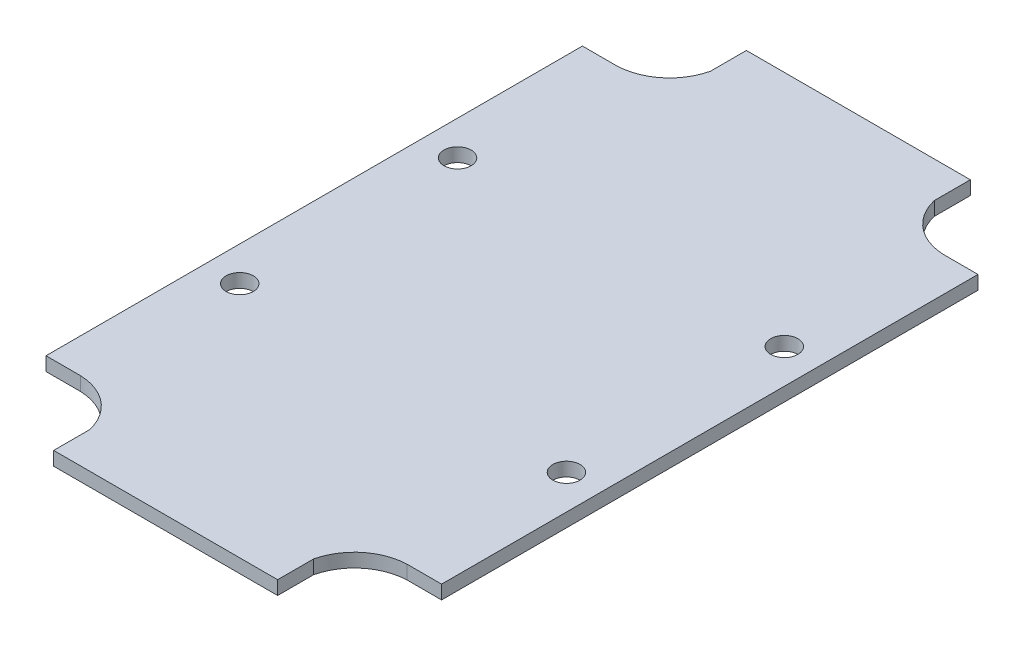
ISO-10303-21;
HEADER;
FILE_DESCRIPTION(('STEP AP214'),'2;1');
FILE_NAME('part.step','',(''),(''),'','','');
FILE_SCHEMA(('AUTOMOTIVE_DESIGN { 1 0 10303 214 1 1 1 1 }'));
ENDSEC;
DATA;
#1=APPLICATION_CONTEXT('core data for automotive mechanical design processes');
#2=APPLICATION_PROTOCOL_DEFINITION('international standard','automotive_design',2000,#1);
#3=PRODUCT_CONTEXT('',#1,'mechanical');
#4=PRODUCT('Part','Part','',(#3));
#5=PRODUCT_RELATED_PRODUCT_CATEGORY('part','',(#4));
#6=PRODUCT_DEFINITION_FORMATION('','',#4);
#7=PRODUCT_DEFINITION_CONTEXT('part definition',#1,'design');
#8=PRODUCT_DEFINITION('design','',#6,#7);
#9=PRODUCT_DEFINITION_SHAPE('','',#8);
#10=(LENGTH_UNIT() NAMED_UNIT(*) SI_UNIT(.MILLI.,.METRE.));
#11=(NAMED_UNIT(*) PLANE_ANGLE_UNIT() SI_UNIT($,.RADIAN.));
#12=(NAMED_UNIT(*) SI_UNIT($,.STERADIAN.) SOLID_ANGLE_UNIT());
#13=UNCERTAINTY_MEASURE_WITH_UNIT(LENGTH_MEASURE(1.E-05),#10,'distance_accuracy_value','');
#14=(GEOMETRIC_REPRESENTATION_CONTEXT(3) GLOBAL_UNCERTAINTY_ASSIGNED_CONTEXT((#13)) GLOBAL_UNIT_ASSIGNED_CONTEXT((#10,
#11,#12)) REPRESENTATION_CONTEXT('',''));
#15=CARTESIAN_POINT('',(0.,0.,0.));
#16=DIRECTION('',(0.,0.,1.));
#17=DIRECTION('',(1.,0.,0.));
#18=AXIS2_PLACEMENT_3D('',#15,#16,#17);
#19=CARTESIAN_POINT('',(-19.2435334272155,1.6,-37.621000833476));
#20=DIRECTION('',(0.,-1.,0.));
#21=DIRECTION('',(0.,0.,-1.));
#22=AXIS2_PLACEMENT_3D('',#19,#20,#21);
#23=CYLINDRICAL_SURFACE('',#22,6.35);
#24=CARTESIAN_POINT('',(-19.2435334272155,0.,-37.621000833476));
#25=DIRECTION('',(0.,-1.,0.));
#26=DIRECTION('',(0.,0.,-1.));
#27=AXIS2_PLACEMENT_3D('',#24,#25,#26);
#28=CIRCLE('',#27,6.35);
#29=CARTESIAN_POINT('',(-13.0557210817313,0.,-36.195));
#30=VERTEX_POINT('',#29);
#31=CARTESIAN_POINT('',(-19.05,0.,-31.2739507460298));
#32=VERTEX_POINT('',#31);
#33=EDGE_CURVE('E187',#30,#32,#28,.T.);
#34=ORIENTED_EDGE('',*,*,#33,.T.);
#35=DIRECTION('',(0.,-1.,0.));
#36=VECTOR('',#35,1.);
#37=CARTESIAN_POINT('',(-19.05,1.6,-31.2739507460298));
#38=LINE('',#37,#36);
#39=CARTESIAN_POINT('',(-19.05,1.6,-31.2739507460298));
#40=VERTEX_POINT('',#39);
#41=EDGE_CURVE('E11',#40,#32,#38,.T.);
#42=ORIENTED_EDGE('',*,*,#41,.F.);
#43=CARTESIAN_POINT('',(-19.2435334272155,1.6,-37.621000833476));
#44=DIRECTION('',(0.,-1.,0.));
#45=DIRECTION('',(0.,0.,-1.));
#46=AXIS2_PLACEMENT_3D('',#43,#44,#45);
#47=CIRCLE('',#46,6.35);
#48=CARTESIAN_POINT('',(-13.0557210817313,1.6,-36.195));
#49=VERTEX_POINT('',#48);
#50=EDGE_CURVE('E235',#49,#40,#47,.T.);
#51=ORIENTED_EDGE('',*,*,#50,.F.);
#52=DIRECTION('',(0.,-1.,0.));
#53=VECTOR('',#52,1.);
#54=CARTESIAN_POINT('',(-13.0557210817313,1.6,-36.195));
#55=LINE('',#54,#53);
#56=EDGE_CURVE('E183',#49,#30,#55,.T.);
#57=ORIENTED_EDGE('',*,*,#56,.T.);
#58=EDGE_LOOP('',(#34,#42,#51,#57));
#59=FACE_BOUND('',#58,.T.);
#60=ADVANCED_FACE('F38',(#59),#23,.F.);
#61=CARTESIAN_POINT('',(-23.0632,1.6,-31.2739507460298));
#62=DIRECTION('',(0.,0.,1.));
#63=DIRECTION('',(1.,0.,0.));
#64=AXIS2_PLACEMENT_3D('',#61,#62,#63);
#65=PLANE('',#64);
#66=DIRECTION('',(-1.,0.,0.));
#67=VECTOR('',#66,1.);
#68=CARTESIAN_POINT('',(-23.0632,0.,-31.2739507460298));
#69=LINE('',#68,#67);
#70=CARTESIAN_POINT('',(-23.0632,0.,-31.2739507460298));
#71=VERTEX_POINT('',#70);
#72=EDGE_CURVE('E191',#32,#71,#69,.T.);
#73=ORIENTED_EDGE('',*,*,#72,.T.);
#74=DIRECTION('',(0.,-1.,0.));
#75=VECTOR('',#74,1.);
#76=CARTESIAN_POINT('',(-23.0632,1.6,-31.2739507460298));
#77=LINE('',#76,#75);
#78=CARTESIAN_POINT('',(-23.0632,1.6,-31.2739507460298));
#79=VERTEX_POINT('',#78);
#80=EDGE_CURVE('E47',#79,#71,#77,.T.);
#81=ORIENTED_EDGE('',*,*,#80,.F.);
#82=DIRECTION('',(-1.,0.,0.));
#83=VECTOR('',#82,1.);
#84=CARTESIAN_POINT('',(-23.0632,1.6,-31.2739507460298));
#85=LINE('',#84,#83);
#86=EDGE_CURVE('E122',#40,#79,#85,.T.);
#87=ORIENTED_EDGE('',*,*,#86,.F.);
#88=ORIENTED_EDGE('',*,*,#41,.T.);
#89=EDGE_LOOP('',(#73,#81,#87,#88));
#90=FACE_BOUND('',#89,.T.);
#91=ADVANCED_FACE('F288',(#90),#65,.F.);
#92=CARTESIAN_POINT('',(-23.0632,1.6,31.2739507460298));
#93=DIRECTION('',(1.,0.,0.));
#94=DIRECTION('',(0.,0.,-1.));
#95=AXIS2_PLACEMENT_3D('',#92,#93,#94);
#96=PLANE('',#95);
#97=DIRECTION('',(0.,0.,1.));
#98=VECTOR('',#97,1.);
#99=CARTESIAN_POINT('',(-23.0632,0.,31.2739507460298));
#100=LINE('',#99,#98);
#101=CARTESIAN_POINT('',(-23.0632,0.,31.2739507460298));
#102=VERTEX_POINT('',#101);
#103=EDGE_CURVE('E196',#71,#102,#100,.T.);
#104=ORIENTED_EDGE('',*,*,#103,.T.);
#105=DIRECTION('',(0.,-1.,0.));
#106=VECTOR('',#105,1.);
#107=CARTESIAN_POINT('',(-23.0632,1.6,31.2739507460298));
#108=LINE('',#107,#106);
#109=CARTESIAN_POINT('',(-23.0632,1.6,31.2739507460298));
#110=VERTEX_POINT('',#109);
#111=EDGE_CURVE('E278',#110,#102,#108,.T.);
#112=ORIENTED_EDGE('',*,*,#111,.F.);
#113=DIRECTION('',(0.,0.,1.));
#114=VECTOR('',#113,1.);
#115=CARTESIAN_POINT('',(-23.0632,1.6,0.));
#116=LINE('',#115,#114);
#117=EDGE_CURVE('E287',#79,#110,#116,.T.);
#118=ORIENTED_EDGE('',*,*,#117,.F.);
#119=ORIENTED_EDGE('',*,*,#80,.T.);
#120=EDGE_LOOP('',(#104,#112,#118,#119));
#121=FACE_BOUND('',#120,.T.);
#122=ADVANCED_FACE('F285',(#121),#96,.F.);
#123=CARTESIAN_POINT('',(-23.0632,1.6,31.2739507460298));
#124=DIRECTION('',(0.,0.,-1.));
#125=DIRECTION('',(-1.,0.,0.));
#126=AXIS2_PLACEMENT_3D('',#123,#124,#125);
#127=PLANE('',#126);
#128=DIRECTION('',(1.,0.,0.));
#129=VECTOR('',#128,1.);
#130=CARTESIAN_POINT('',(-23.0632,0.,31.2739507460298));
#131=LINE('',#130,#129);
#132=CARTESIAN_POINT('',(-19.05,0.,31.2739507460298));
#133=VERTEX_POINT('',#132);
#134=EDGE_CURVE('E199',#102,#133,#131,.T.);
#135=ORIENTED_EDGE('',*,*,#134,.T.);
#136=DIRECTION('',(0.,-1.,0.));
#137=VECTOR('',#136,1.);
#138=CARTESIAN_POINT('',(-19.05,1.6,31.2739507460298));
#139=LINE('',#138,#137);
#140=CARTESIAN_POINT('',(-19.05,1.6,31.2739507460298));
#141=VERTEX_POINT('',#140);
#142=EDGE_CURVE('E274',#141,#133,#139,.T.);
#143=ORIENTED_EDGE('',*,*,#142,.F.);
#144=DIRECTION('',(1.,0.,0.));
#145=VECTOR('',#144,1.);
#146=CARTESIAN_POINT('',(-23.0632,1.6,31.2739507460298));
#147=LINE('',#146,#145);
#148=EDGE_CURVE('E308',#110,#141,#147,.T.);
#149=ORIENTED_EDGE('',*,*,#148,.F.);
#150=ORIENTED_EDGE('',*,*,#111,.T.);
#151=EDGE_LOOP('',(#135,#143,#149,#150));
#152=FACE_BOUND('',#151,.T.);
#153=ADVANCED_FACE('F298',(#152),#127,.F.);
#154=CARTESIAN_POINT('',(-19.2435334272155,1.6,37.621000833476));
#155=DIRECTION('',(0.,-1.,0.));
#156=DIRECTION('',(0.,0.,-1.));
#157=AXIS2_PLACEMENT_3D('',#154,#155,#156);
#158=CYLINDRICAL_SURFACE('',#157,6.35);
#159=CARTESIAN_POINT('',(-19.2435334272155,0.,37.621000833476));
#160=DIRECTION('',(0.,-1.,0.));
#161=DIRECTION('',(0.,0.,1.));
#162=AXIS2_PLACEMENT_3D('',#159,#160,#161);
#163=CIRCLE('',#162,6.35);
#164=CARTESIAN_POINT('',(-13.0557210817314,0.,36.195));
#165=VERTEX_POINT('',#164);
#166=EDGE_CURVE('E202',#133,#165,#163,.T.);
#167=ORIENTED_EDGE('',*,*,#166,.T.);
#168=DIRECTION('',(0.,-1.,0.));
#169=VECTOR('',#168,1.);
#170=CARTESIAN_POINT('',(-13.0557210817314,1.6,36.195));
#171=LINE('',#170,#169);
#172=CARTESIAN_POINT('',(-13.0557210817314,1.6,36.195));
#173=VERTEX_POINT('',#172);
#174=EDGE_CURVE('E270',#173,#165,#171,.T.);
#175=ORIENTED_EDGE('',*,*,#174,.F.);
#176=CARTESIAN_POINT('',(-19.2435334272155,1.6,37.621000833476));
#177=DIRECTION('',(0.,-1.,0.));
#178=DIRECTION('',(0.,0.,1.));
#179=AXIS2_PLACEMENT_3D('',#176,#177,#178);
#180=CIRCLE('',#179,6.35);
#181=EDGE_CURVE('E304',#141,#173,#180,.T.);
#182=ORIENTED_EDGE('',*,*,#181,.F.);
#183=ORIENTED_EDGE('',*,*,#142,.T.);
#184=EDGE_LOOP('',(#167,#175,#182,#183));
#185=FACE_BOUND('',#184,.T.);
#186=ADVANCED_FACE('F302',(#185),#158,.F.);
#187=CARTESIAN_POINT('',(-13.0557210817314,1.6,36.195));
#188=DIRECTION('',(1.,0.,0.));
#189=DIRECTION('',(0.,0.,-1.));
#190=AXIS2_PLACEMENT_3D('',#187,#188,#189);
#191=PLANE('',#190);
#192=DIRECTION('',(0.,0.,1.));
#193=VECTOR('',#192,1.);
#194=CARTESIAN_POINT('',(-13.0557210817314,0.,36.195));
#195=LINE('',#194,#193);
#196=CARTESIAN_POINT('',(-13.0557210817314,0.,40.386));
#197=VERTEX_POINT('',#196);
#198=EDGE_CURVE('E205',#165,#197,#195,.T.);
#199=ORIENTED_EDGE('',*,*,#198,.T.);
#200=DIRECTION('',(0.,-1.,0.));
#201=VECTOR('',#200,1.);
#202=CARTESIAN_POINT('',(-13.0557210817314,1.6,40.386));
#203=LINE('',#202,#201);
#204=CARTESIAN_POINT('',(-13.0557210817314,1.6,40.386));
#205=VERTEX_POINT('',#204);
#206=EDGE_CURVE('E266',#205,#197,#203,.T.);
#207=ORIENTED_EDGE('',*,*,#206,.F.);
#208=DIRECTION('',(0.,0.,1.));
#209=VECTOR('',#208,1.);
#210=CARTESIAN_POINT('',(-13.0557210817314,1.6,36.195));
#211=LINE('',#210,#209);
#212=EDGE_CURVE('E307',#173,#205,#211,.T.);
#213=ORIENTED_EDGE('',*,*,#212,.F.);
#214=ORIENTED_EDGE('',*,*,#174,.T.);
#215=EDGE_LOOP('',(#199,#207,#213,#214));
#216=FACE_BOUND('',#215,.T.);
#217=ADVANCED_FACE('F369',(#216),#191,.F.);
#218=CARTESIAN_POINT('',(-13.0557210817314,1.6,40.386));
#219=DIRECTION('',(0.,0.,-1.));
#220=DIRECTION('',(-1.,0.,0.));
#221=AXIS2_PLACEMENT_3D('',#218,#219,#220);
#222=PLANE('',#221);
#223=DIRECTION('',(1.,0.,0.));
#224=VECTOR('',#223,1.);
#225=CARTESIAN_POINT('',(-13.0557210817314,0.,40.386));
#226=LINE('',#225,#224);
#227=CARTESIAN_POINT('',(13.0557210817313,0.,40.386));
#228=VERTEX_POINT('',#227);
#229=EDGE_CURVE('E208',#197,#228,#226,.T.);
#230=ORIENTED_EDGE('',*,*,#229,.T.);
#231=DIRECTION('',(0.,-1.,0.));
#232=VECTOR('',#231,1.);
#233=CARTESIAN_POINT('',(13.0557210817313,1.6,40.386));
#234=LINE('',#233,#232);
#235=CARTESIAN_POINT('',(13.0557210817313,1.6,40.386));
#236=VERTEX_POINT('',#235);
#237=EDGE_CURVE('E262',#236,#228,#234,.T.);
#238=ORIENTED_EDGE('',*,*,#237,.F.);
#239=DIRECTION('',(1.,0.,0.));
#240=VECTOR('',#239,1.);
#241=CARTESIAN_POINT('',(-13.0557210817314,1.6,40.386));
#242=LINE('',#241,#240);
#243=EDGE_CURVE('E312',#205,#236,#242,.T.);
#244=ORIENTED_EDGE('',*,*,#243,.F.);
#245=ORIENTED_EDGE('',*,*,#206,.T.);
#246=EDGE_LOOP('',(#230,#238,#244,#245));
#247=FACE_BOUND('',#246,.T.);
#248=ADVANCED_FACE('F366',(#247),#222,.F.);
#249=CARTESIAN_POINT('',(13.0557210817313,1.6,36.195));
#250=DIRECTION('',(-1.,0.,0.));
#251=DIRECTION('',(0.,0.,1.));
#252=AXIS2_PLACEMENT_3D('',#249,#250,#251);
#253=PLANE('',#252);
#254=DIRECTION('',(0.,0.,-1.));
#255=VECTOR('',#254,1.);
#256=CARTESIAN_POINT('',(13.0557210817313,0.,36.195));
#257=LINE('',#256,#255);
#258=CARTESIAN_POINT('',(13.0557210817313,0.,36.195));
#259=VERTEX_POINT('',#258);
#260=EDGE_CURVE('E211',#228,#259,#257,.T.);
#261=ORIENTED_EDGE('',*,*,#260,.T.);
#262=DIRECTION('',(0.,-1.,0.));
#263=VECTOR('',#262,1.);
#264=CARTESIAN_POINT('',(13.0557210817313,1.6,36.195));
#265=LINE('',#264,#263);
#266=CARTESIAN_POINT('',(13.0557210817313,1.6,36.195));
#267=VERTEX_POINT('',#266);
#268=EDGE_CURVE('E258',#267,#259,#265,.T.);
#269=ORIENTED_EDGE('',*,*,#268,.F.);
#270=DIRECTION('',(0.,0.,-1.));
#271=VECTOR('',#270,1.);
#272=CARTESIAN_POINT('',(13.0557210817313,1.6,36.195));
#273=LINE('',#272,#271);
#274=EDGE_CURVE('E319',#236,#267,#273,.T.);
#275=ORIENTED_EDGE('',*,*,#274,.F.);
#276=ORIENTED_EDGE('',*,*,#237,.T.);
#277=EDGE_LOOP('',(#261,#269,#275,#276));
#278=FACE_BOUND('',#277,.T.);
#279=ADVANCED_FACE('F361',(#278),#253,.F.);
#280=CARTESIAN_POINT('',(19.2435334272155,1.6,37.621000833476));
#281=DIRECTION('',(0.,-1.,0.));
#282=DIRECTION('',(0.,0.,-1.));
#283=AXIS2_PLACEMENT_3D('',#280,#281,#282);
#284=CYLINDRICAL_SURFACE('',#283,6.35);
#285=CARTESIAN_POINT('',(19.2435334272155,0.,37.621000833476));
#286=DIRECTION('',(0.,-1.,0.));
#287=DIRECTION('',(0.,0.,-1.));
#288=AXIS2_PLACEMENT_3D('',#285,#286,#287);
#289=CIRCLE('',#288,6.35);
#290=CARTESIAN_POINT('',(19.05,0.,31.2739507460298));
#291=VERTEX_POINT('',#290);
#292=EDGE_CURVE('E214',#259,#291,#289,.T.);
#293=ORIENTED_EDGE('',*,*,#292,.T.);
#294=DIRECTION('',(0.,-1.,0.));
#295=VECTOR('',#294,1.);
#296=CARTESIAN_POINT('',(19.05,1.6,31.2739507460298));
#297=LINE('',#296,#295);
#298=CARTESIAN_POINT('',(19.05,1.6,31.2739507460298));
#299=VERTEX_POINT('',#298);
#300=EDGE_CURVE('E254',#299,#291,#297,.T.);
#301=ORIENTED_EDGE('',*,*,#300,.F.);
#302=CARTESIAN_POINT('',(19.2435334272155,1.6,37.621000833476));
#303=DIRECTION('',(0.,-1.,0.));
#304=DIRECTION('',(0.,0.,-1.));
#305=AXIS2_PLACEMENT_3D('',#302,#303,#304);
#306=CIRCLE('',#305,6.35);
#307=EDGE_CURVE('E322',#267,#299,#306,.T.);
#308=ORIENTED_EDGE('',*,*,#307,.F.);
#309=ORIENTED_EDGE('',*,*,#268,.T.);
#310=EDGE_LOOP('',(#293,#301,#308,#309));
#311=FACE_BOUND('',#310,.T.);
#312=ADVANCED_FACE('F356',(#311),#284,.F.);
#313=CARTESIAN_POINT('',(23.0632,1.6,31.2739507460298));
#314=DIRECTION('',(0.,0.,-1.));
#315=DIRECTION('',(-1.,0.,0.));
#316=AXIS2_PLACEMENT_3D('',#313,#314,#315);
#317=PLANE('',#316);
#318=DIRECTION('',(1.,0.,0.));
#319=VECTOR('',#318,1.);
#320=CARTESIAN_POINT('',(23.0632,0.,31.2739507460298));
#321=LINE('',#320,#319);
#322=CARTESIAN_POINT('',(23.0632,0.,31.2739507460298));
#323=VERTEX_POINT('',#322);
#324=EDGE_CURVE('E217',#291,#323,#321,.T.);
#325=ORIENTED_EDGE('',*,*,#324,.T.);
#326=DIRECTION('',(0.,-1.,0.));
#327=VECTOR('',#326,1.);
#328=CARTESIAN_POINT('',(23.0632,1.6,31.2739507460298));
#329=LINE('',#328,#327);
#330=CARTESIAN_POINT('',(23.0632,1.6,31.2739507460298));
#331=VERTEX_POINT('',#330);
#332=EDGE_CURVE('E250',#331,#323,#329,.T.);
#333=ORIENTED_EDGE('',*,*,#332,.F.);
#334=DIRECTION('',(1.,0.,0.));
#335=VECTOR('',#334,1.);
#336=CARTESIAN_POINT('',(23.0632,1.6,31.2739507460298));
#337=LINE('',#336,#335);
#338=EDGE_CURVE('E325',#299,#331,#337,.T.);
#339=ORIENTED_EDGE('',*,*,#338,.F.);
#340=ORIENTED_EDGE('',*,*,#300,.T.);
#341=EDGE_LOOP('',(#325,#333,#339,#340));
#342=FACE_BOUND('',#341,.T.);
#343=ADVANCED_FACE('F352',(#342),#317,.F.);
#344=CARTESIAN_POINT('',(23.0632,1.6,-31.2739507460298));
#345=DIRECTION('',(-1.,0.,0.));
#346=DIRECTION('',(0.,0.,1.));
#347=AXIS2_PLACEMENT_3D('',#344,#345,#346);
#348=PLANE('',#347);
#349=DIRECTION('',(0.,0.,-1.));
#350=VECTOR('',#349,1.);
#351=CARTESIAN_POINT('',(23.0632,0.,-31.2739507460298));
#352=LINE('',#351,#350);
#353=CARTESIAN_POINT('',(23.0632,0.,-31.2739507460298));
#354=VERTEX_POINT('',#353);
#355=EDGE_CURVE('E220',#323,#354,#352,.T.);
#356=ORIENTED_EDGE('',*,*,#355,.T.);
#357=DIRECTION('',(0.,-1.,0.));
#358=VECTOR('',#357,1.);
#359=CARTESIAN_POINT('',(23.0632,1.6,-31.2739507460298));
#360=LINE('',#359,#358);
#361=CARTESIAN_POINT('',(23.0632,1.6,-31.2739507460298));
#362=VERTEX_POINT('',#361);
#363=EDGE_CURVE('E246',#362,#354,#360,.T.);
#364=ORIENTED_EDGE('',*,*,#363,.F.);
#365=DIRECTION('',(0.,0.,-1.));
#366=VECTOR('',#365,1.);
#367=CARTESIAN_POINT('',(23.0632,1.6,-31.2739507460298));
#368=LINE('',#367,#366);
#369=EDGE_CURVE('E328',#331,#362,#368,.T.);
#370=ORIENTED_EDGE('',*,*,#369,.F.);
#371=ORIENTED_EDGE('',*,*,#332,.T.);
#372=EDGE_LOOP('',(#356,#364,#370,#371));
#373=FACE_BOUND('',#372,.T.);
#374=ADVANCED_FACE('F348',(#373),#348,.F.);
#375=CARTESIAN_POINT('',(23.0632,1.6,-31.2739507460298));
#376=DIRECTION('',(0.,0.,1.));
#377=DIRECTION('',(1.,0.,0.));
#378=AXIS2_PLACEMENT_3D('',#375,#376,#377);
#379=PLANE('',#378);
#380=DIRECTION('',(-1.,0.,0.));
#381=VECTOR('',#380,1.);
#382=CARTESIAN_POINT('',(23.0632,0.,-31.2739507460298));
#383=LINE('',#382,#381);
#384=CARTESIAN_POINT('',(19.05,0.,-31.2739507460298));
#385=VERTEX_POINT('',#384);
#386=EDGE_CURVE('E223',#354,#385,#383,.T.);
#387=ORIENTED_EDGE('',*,*,#386,.T.);
#388=DIRECTION('',(0.,-1.,0.));
#389=VECTOR('',#388,1.);
#390=CARTESIAN_POINT('',(19.05,1.6,-31.2739507460298));
#391=LINE('',#390,#389);
#392=CARTESIAN_POINT('',(19.05,1.6,-31.2739507460298));
#393=VERTEX_POINT('',#392);
#394=EDGE_CURVE('E242',#393,#385,#391,.T.);
#395=ORIENTED_EDGE('',*,*,#394,.F.);
#396=DIRECTION('',(-1.,0.,0.));
#397=VECTOR('',#396,1.);
#398=CARTESIAN_POINT('',(23.0632,1.6,-31.2739507460298));
#399=LINE('',#398,#397);
#400=EDGE_CURVE('E331',#362,#393,#399,.T.);
#401=ORIENTED_EDGE('',*,*,#400,.F.);
#402=ORIENTED_EDGE('',*,*,#363,.T.);
#403=EDGE_LOOP('',(#387,#395,#401,#402));
#404=FACE_BOUND('',#403,.T.);
#405=ADVANCED_FACE('F339',(#404),#379,.F.);
#406=CARTESIAN_POINT('',(19.2435334272155,1.6,-37.621000833476));
#407=DIRECTION('',(0.,-1.,0.));
#408=DIRECTION('',(0.,0.,-1.));
#409=AXIS2_PLACEMENT_3D('',#406,#407,#408);
#410=CYLINDRICAL_SURFACE('',#409,6.35);
#411=CARTESIAN_POINT('',(19.2435334272155,0.,-37.621000833476));
#412=DIRECTION('',(0.,-1.,0.));
#413=DIRECTION('',(0.,0.,1.));
#414=AXIS2_PLACEMENT_3D('',#411,#412,#413);
#415=CIRCLE('',#414,6.35);
#416=CARTESIAN_POINT('',(13.0557210817314,0.,-36.195));
#417=VERTEX_POINT('',#416);
#418=EDGE_CURVE('E226',#385,#417,#415,.T.);
#419=ORIENTED_EDGE('',*,*,#418,.T.);
#420=DIRECTION('',(0.,-1.,0.));
#421=VECTOR('',#420,1.);
#422=CARTESIAN_POINT('',(13.0557210817314,1.6,-36.195));
#423=LINE('',#422,#421);
#424=CARTESIAN_POINT('',(13.0557210817314,1.6,-36.195));
#425=VERTEX_POINT('',#424);
#426=EDGE_CURVE('E176',#425,#417,#423,.T.);
#427=ORIENTED_EDGE('',*,*,#426,.F.);
#428=CARTESIAN_POINT('',(19.2435334272155,1.6,-37.621000833476));
#429=DIRECTION('',(0.,-1.,0.));
#430=DIRECTION('',(0.,0.,1.));
#431=AXIS2_PLACEMENT_3D('',#428,#429,#430);
#432=CIRCLE('',#431,6.35);
#433=EDGE_CURVE('E165',#393,#425,#432,.T.);
#434=ORIENTED_EDGE('',*,*,#433,.F.);
#435=ORIENTED_EDGE('',*,*,#394,.T.);
#436=EDGE_LOOP('',(#419,#427,#434,#435));
#437=FACE_BOUND('',#436,.T.);
#438=ADVANCED_FACE('F343',(#437),#410,.F.);
#439=CARTESIAN_POINT('',(13.0557210817314,1.6,-36.195));
#440=DIRECTION('',(-1.,0.,0.));
#441=DIRECTION('',(0.,0.,1.));
#442=AXIS2_PLACEMENT_3D('',#439,#440,#441);
#443=PLANE('',#442);
#444=DIRECTION('',(0.,0.,-1.));
#445=VECTOR('',#444,1.);
#446=CARTESIAN_POINT('',(13.0557210817314,0.,-36.195));
#447=LINE('',#446,#445);
#448=CARTESIAN_POINT('',(13.0557210817314,0.,-40.386));
#449=VERTEX_POINT('',#448);
#450=EDGE_CURVE('E174',#417,#449,#447,.T.);
#451=ORIENTED_EDGE('',*,*,#450,.T.);
#452=DIRECTION('',(0.,-1.,0.));
#453=VECTOR('',#452,1.);
#454=CARTESIAN_POINT('',(13.0557210817314,1.6,-40.386));
#455=LINE('',#454,#453);
#456=CARTESIAN_POINT('',(13.0557210817314,1.6,-40.386));
#457=VERTEX_POINT('',#456);
#458=EDGE_CURVE('E171',#457,#449,#455,.T.);
#459=ORIENTED_EDGE('',*,*,#458,.F.);
#460=DIRECTION('',(0.,0.,-1.));
#461=VECTOR('',#460,1.);
#462=CARTESIAN_POINT('',(13.0557210817314,1.6,-36.195));
#463=LINE('',#462,#461);
#464=EDGE_CURVE('E159',#425,#457,#463,.T.);
#465=ORIENTED_EDGE('',*,*,#464,.F.);
#466=ORIENTED_EDGE('',*,*,#426,.T.);
#467=EDGE_LOOP('',(#451,#459,#465,#466));
#468=FACE_BOUND('',#467,.T.);
#469=ADVANCED_FACE('F172',(#468),#443,.F.);
#470=CARTESIAN_POINT('',(-13.0557210817314,1.6,-40.386));
#471=DIRECTION('',(0.,0.,1.));
#472=DIRECTION('',(1.,0.,0.));
#473=AXIS2_PLACEMENT_3D('',#470,#471,#472);
#474=PLANE('',#473);
#475=DIRECTION('',(-1.,0.,0.));
#476=VECTOR('',#475,1.);
#477=CARTESIAN_POINT('',(-13.0557210817314,0.,-40.386));
#478=LINE('',#477,#476);
#479=CARTESIAN_POINT('',(-13.0557210817314,0.,-40.386));
#480=VERTEX_POINT('',#479);
#481=EDGE_CURVE('E108',#449,#480,#478,.T.);
#482=ORIENTED_EDGE('',*,*,#481,.T.);
#483=DIRECTION('',(0.,-1.,0.));
#484=VECTOR('',#483,1.);
#485=CARTESIAN_POINT('',(-13.0557210817314,1.6,-40.386));
#486=LINE('',#485,#484);
#487=CARTESIAN_POINT('',(-13.0557210817314,1.6,-40.386));
#488=VERTEX_POINT('',#487);
#489=EDGE_CURVE('E177',#488,#480,#486,.T.);
#490=ORIENTED_EDGE('',*,*,#489,.F.);
#491=DIRECTION('',(-1.,0.,0.));
#492=VECTOR('',#491,1.);
#493=CARTESIAN_POINT('',(-13.0557210817314,1.6,-40.386));
#494=LINE('',#493,#492);
#495=EDGE_CURVE('E163',#457,#488,#494,.T.);
#496=ORIENTED_EDGE('',*,*,#495,.F.);
#497=ORIENTED_EDGE('',*,*,#458,.T.);
#498=EDGE_LOOP('',(#482,#490,#496,#497));
#499=FACE_BOUND('',#498,.T.);
#500=ADVANCED_FACE('F179',(#499),#474,.F.);
#501=CARTESIAN_POINT('',(-13.0557210817313,1.6,-36.195));
#502=DIRECTION('',(1.,0.,0.));
#503=DIRECTION('',(0.,0.,-1.));
#504=AXIS2_PLACEMENT_3D('',#501,#502,#503);
#505=PLANE('',#504);
#506=DIRECTION('',(0.,0.,1.));
#507=VECTOR('',#506,1.);
#508=CARTESIAN_POINT('',(-13.0557210817313,0.,-36.195));
#509=LINE('',#508,#507);
#510=EDGE_CURVE('E114',#480,#30,#509,.T.);
#511=ORIENTED_EDGE('',*,*,#510,.T.);
#512=ORIENTED_EDGE('',*,*,#56,.F.);
#513=DIRECTION('',(0.,0.,1.));
#514=VECTOR('',#513,1.);
#515=CARTESIAN_POINT('',(-13.0557210817313,1.6,-36.195));
#516=LINE('',#515,#514);
#517=EDGE_CURVE('E55',#488,#49,#516,.T.);
#518=ORIENTED_EDGE('',*,*,#517,.F.);
#519=ORIENTED_EDGE('',*,*,#489,.T.);
#520=EDGE_LOOP('',(#511,#512,#518,#519));
#521=FACE_BOUND('',#520,.T.);
#522=ADVANCED_FACE('F384',(#521),#505,.F.);
#523=CARTESIAN_POINT('',(-19.2435334272155,1.6,-37.621000833476));
#524=DIRECTION('',(0.,-1.,0.));
#525=DIRECTION('',(0.,0.,-1.));
#526=AXIS2_PLACEMENT_3D('',#523,#524,#525);
#527=PLANE('',#526);
#528=CARTESIAN_POINT('',(-19.05,1.6,12.7));
#529=DIRECTION('',(0.,1.,0.));
#530=DIRECTION('',(0.,0.,-1.));
#531=AXIS2_PLACEMENT_3D('',#528,#529,#530);
#532=CIRCLE('',#531,1.5875);
#533=CARTESIAN_POINT('',(-19.05,1.6,11.1125));
#534=VERTEX_POINT('',#533);
#535=EDGE_CURVE('E509',#534,#534,#532,.T.);
#536=ORIENTED_EDGE('',*,*,#535,.F.);
#537=EDGE_LOOP('',(#536));
#538=FACE_BOUND('',#537,.T.);
#539=CARTESIAN_POINT('',(19.05,1.6,12.7));
#540=DIRECTION('',(0.,1.,0.));
#541=DIRECTION('',(0.,0.,1.));
#542=AXIS2_PLACEMENT_3D('',#539,#540,#541);
#543=CIRCLE('',#542,1.58750000000001);
#544=CARTESIAN_POINT('',(19.05,1.6,14.2875));
#545=VERTEX_POINT('',#544);
#546=EDGE_CURVE('E513',#545,#545,#543,.T.);
#547=ORIENTED_EDGE('',*,*,#546,.F.);
#548=EDGE_LOOP('',(#547));
#549=FACE_BOUND('',#548,.T.);
#550=CARTESIAN_POINT('',(19.05,1.6,-12.7));
#551=DIRECTION('',(0.,1.,0.));
#552=DIRECTION('',(0.,0.,-1.));
#553=AXIS2_PLACEMENT_3D('',#550,#551,#552);
#554=CIRCLE('',#553,1.58750000000001);
#555=CARTESIAN_POINT('',(19.05,1.6,-14.2875));
#556=VERTEX_POINT('',#555);
#557=EDGE_CURVE('E532',#556,#556,#554,.T.);
#558=ORIENTED_EDGE('',*,*,#557,.F.);
#559=EDGE_LOOP('',(#558));
#560=FACE_BOUND('',#559,.T.);
#561=CARTESIAN_POINT('',(-19.05,1.6,-12.7));
#562=DIRECTION('',(0.,1.,0.));
#563=DIRECTION('',(0.,0.,1.));
#564=AXIS2_PLACEMENT_3D('',#561,#562,#563);
#565=CIRCLE('',#564,1.5875);
#566=CARTESIAN_POINT('',(-19.05,1.6,-11.1125));
#567=VERTEX_POINT('',#566);
#568=EDGE_CURVE('E520',#567,#567,#565,.T.);
#569=ORIENTED_EDGE('',*,*,#568,.F.);
#570=EDGE_LOOP('',(#569));
#571=FACE_BOUND('',#570,.T.);
#572=ORIENTED_EDGE('',*,*,#50,.T.);
#573=ORIENTED_EDGE('',*,*,#86,.T.);
#574=ORIENTED_EDGE('',*,*,#117,.T.);
#575=ORIENTED_EDGE('',*,*,#148,.T.);
#576=ORIENTED_EDGE('',*,*,#181,.T.);
#577=ORIENTED_EDGE('',*,*,#212,.T.);
#578=ORIENTED_EDGE('',*,*,#243,.T.);
#579=ORIENTED_EDGE('',*,*,#274,.T.);
#580=ORIENTED_EDGE('',*,*,#307,.T.);
#581=ORIENTED_EDGE('',*,*,#338,.T.);
#582=ORIENTED_EDGE('',*,*,#369,.T.);
#583=ORIENTED_EDGE('',*,*,#400,.T.);
#584=ORIENTED_EDGE('',*,*,#433,.T.);
#585=ORIENTED_EDGE('',*,*,#464,.T.);
#586=ORIENTED_EDGE('',*,*,#495,.T.);
#587=ORIENTED_EDGE('',*,*,#517,.T.);
#588=EDGE_LOOP('',(#572,#573,#574,#575,#576,#577,#578,#579,#580,#581,#582,#583,#584,#585,#586,#587));
#589=FACE_BOUND('',#588,.T.);
#590=ADVANCED_FACE('F161',(#538,#549,#560,#571,#589),#527,.F.);
#591=CARTESIAN_POINT('',(-19.2435334272155,0.,-37.621000833476));
#592=DIRECTION('',(0.,-1.,0.));
#593=DIRECTION('',(0.,0.,-1.));
#594=AXIS2_PLACEMENT_3D('',#591,#592,#593);
#595=PLANE('',#594);
#596=CARTESIAN_POINT('',(-19.05,0.,12.7));
#597=DIRECTION('',(0.,1.,0.));
#598=DIRECTION('',(0.,0.,-1.));
#599=AXIS2_PLACEMENT_3D('',#596,#597,#598);
#600=CIRCLE('',#599,1.5875);
#601=CARTESIAN_POINT('',(-19.05,0.,11.1125));
#602=VERTEX_POINT('',#601);
#603=EDGE_CURVE('E506',#602,#602,#600,.T.);
#604=ORIENTED_EDGE('',*,*,#603,.T.);
#605=EDGE_LOOP('',(#604));
#606=FACE_BOUND('',#605,.T.);
#607=CARTESIAN_POINT('',(19.05,0.,12.7));
#608=DIRECTION('',(0.,1.,0.));
#609=DIRECTION('',(0.,0.,1.));
#610=AXIS2_PLACEMENT_3D('',#607,#608,#609);
#611=CIRCLE('',#610,1.58750000000001);
#612=CARTESIAN_POINT('',(19.05,0.,14.2875));
#613=VERTEX_POINT('',#612);
#614=EDGE_CURVE('E536',#613,#613,#611,.T.);
#615=ORIENTED_EDGE('',*,*,#614,.T.);
#616=EDGE_LOOP('',(#615));
#617=FACE_BOUND('',#616,.T.);
#618=CARTESIAN_POINT('',(19.05,0.,-12.7));
#619=DIRECTION('',(0.,1.,0.));
#620=DIRECTION('',(0.,0.,-1.));
#621=AXIS2_PLACEMENT_3D('',#618,#619,#620);
#622=CIRCLE('',#621,1.58750000000001);
#623=CARTESIAN_POINT('',(19.05,0.,-14.2875));
#624=VERTEX_POINT('',#623);
#625=EDGE_CURVE('E524',#624,#624,#622,.T.);
#626=ORIENTED_EDGE('',*,*,#625,.T.);
#627=EDGE_LOOP('',(#626));
#628=FACE_BOUND('',#627,.T.);
#629=CARTESIAN_POINT('',(-19.05,0.,-12.7));
#630=DIRECTION('',(0.,1.,0.));
#631=DIRECTION('',(0.,0.,1.));
#632=AXIS2_PLACEMENT_3D('',#629,#630,#631);
#633=CIRCLE('',#632,1.5875);
#634=CARTESIAN_POINT('',(-19.05,0.,-11.1125));
#635=VERTEX_POINT('',#634);
#636=EDGE_CURVE('E192',#635,#635,#633,.T.);
#637=ORIENTED_EDGE('',*,*,#636,.T.);
#638=EDGE_LOOP('',(#637));
#639=FACE_BOUND('',#638,.T.);
#640=ORIENTED_EDGE('',*,*,#33,.F.);
#641=ORIENTED_EDGE('',*,*,#510,.F.);
#642=ORIENTED_EDGE('',*,*,#481,.F.);
#643=ORIENTED_EDGE('',*,*,#450,.F.);
#644=ORIENTED_EDGE('',*,*,#418,.F.);
#645=ORIENTED_EDGE('',*,*,#386,.F.);
#646=ORIENTED_EDGE('',*,*,#355,.F.);
#647=ORIENTED_EDGE('',*,*,#324,.F.);
#648=ORIENTED_EDGE('',*,*,#292,.F.);
#649=ORIENTED_EDGE('',*,*,#260,.F.);
#650=ORIENTED_EDGE('',*,*,#229,.F.);
#651=ORIENTED_EDGE('',*,*,#198,.F.);
#652=ORIENTED_EDGE('',*,*,#166,.F.);
#653=ORIENTED_EDGE('',*,*,#134,.F.);
#654=ORIENTED_EDGE('',*,*,#103,.F.);
#655=ORIENTED_EDGE('',*,*,#72,.F.);
#656=EDGE_LOOP('',(#640,#641,#642,#643,#644,#645,#646,#647,#648,#649,#650,#651,#652,#653,#654,#655));
#657=FACE_BOUND('',#656,.T.);
#658=ADVANCED_FACE('F292',(#606,#617,#628,#639,#657),#595,.T.);
#659=CARTESIAN_POINT('',(-19.05,0.,-12.7));
#660=DIRECTION('',(0.,1.,0.));
#661=DIRECTION('',(0.,0.,1.));
#662=AXIS2_PLACEMENT_3D('',#659,#660,#661);
#663=CYLINDRICAL_SURFACE('',#662,1.5875);
#664=ORIENTED_EDGE('',*,*,#636,.F.);
#665=EDGE_LOOP('',(#664));
#666=FACE_BOUND('',#665,.T.);
#667=ORIENTED_EDGE('',*,*,#568,.T.);
#668=EDGE_LOOP('',(#667));
#669=FACE_BOUND('',#668,.T.);
#670=ADVANCED_FACE('F460',(#666,#669),#663,.F.);
#671=CARTESIAN_POINT('',(19.05,0.,-12.7));
#672=DIRECTION('',(0.,1.,0.));
#673=DIRECTION('',(0.,0.,1.));
#674=AXIS2_PLACEMENT_3D('',#671,#672,#673);
#675=CYLINDRICAL_SURFACE('',#674,1.58750000000001);
#676=ORIENTED_EDGE('',*,*,#625,.F.);
#677=EDGE_LOOP('',(#676));
#678=FACE_BOUND('',#677,.T.);
#679=ORIENTED_EDGE('',*,*,#557,.T.);
#680=EDGE_LOOP('',(#679));
#681=FACE_BOUND('',#680,.T.);
#682=ADVANCED_FACE('F469',(#678,#681),#675,.F.);
#683=CARTESIAN_POINT('',(19.05,0.,12.7));
#684=DIRECTION('',(0.,1.,0.));
#685=DIRECTION('',(0.,0.,1.));
#686=AXIS2_PLACEMENT_3D('',#683,#684,#685);
#687=CYLINDRICAL_SURFACE('',#686,1.58750000000001);
#688=ORIENTED_EDGE('',*,*,#614,.F.);
#689=EDGE_LOOP('',(#688));
#690=FACE_BOUND('',#689,.T.);
#691=ORIENTED_EDGE('',*,*,#546,.T.);
#692=EDGE_LOOP('',(#691));
#693=FACE_BOUND('',#692,.T.);
#694=ADVANCED_FACE('F479',(#690,#693),#687,.F.);
#695=CARTESIAN_POINT('',(-19.05,0.,12.7));
#696=DIRECTION('',(0.,1.,0.));
#697=DIRECTION('',(0.,0.,1.));
#698=AXIS2_PLACEMENT_3D('',#695,#696,#697);
#699=CYLINDRICAL_SURFACE('',#698,1.5875);
#700=ORIENTED_EDGE('',*,*,#603,.F.);
#701=EDGE_LOOP('',(#700));
#702=FACE_BOUND('',#701,.T.);
#703=ORIENTED_EDGE('',*,*,#535,.T.);
#704=EDGE_LOOP('',(#703));
#705=FACE_BOUND('',#704,.T.);
#706=ADVANCED_FACE('F489',(#702,#705),#699,.F.);
#707=CLOSED_SHELL('',(#60,#91,#122,#153,#186,#217,#248,#279,#312,#343,#374,#405,#438,#469,#500,
#522,#590,#658,#670,#682,#694,#706));
#708=MANIFOLD_SOLID_BREP('B2',#707);
#709=ADVANCED_BREP_SHAPE_REPRESENTATION('',(#18,#708),#14);
#710=SHAPE_DEFINITION_REPRESENTATION(#9,#709);
ENDSEC;
END-ISO-10303-21;
